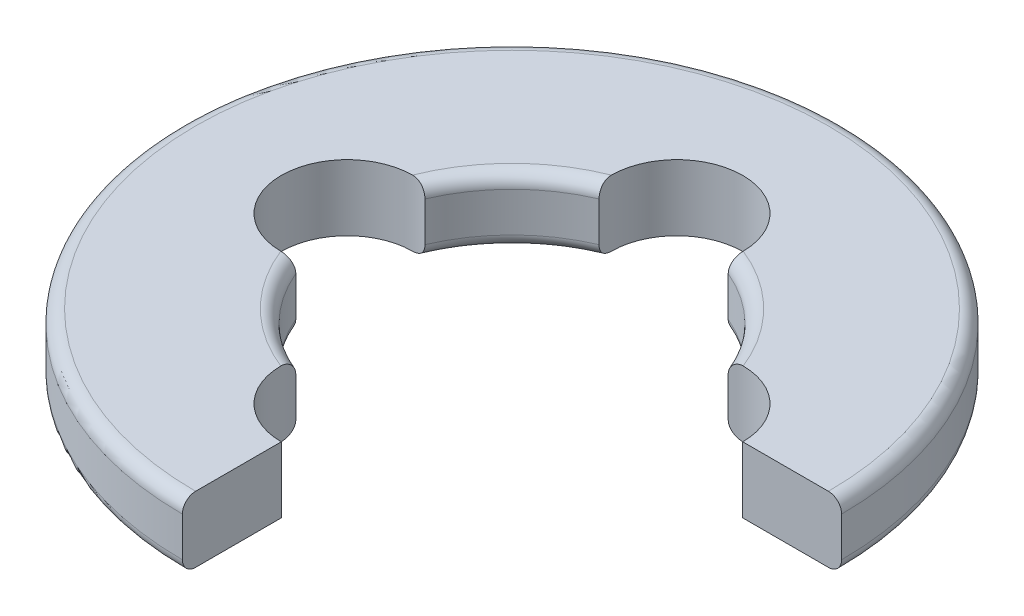
ISO-10303-21;
HEADER;
FILE_DESCRIPTION(('STEP AP214'),'2;1');
FILE_NAME('part.step','',(''),(''),'','','');
FILE_SCHEMA(('AUTOMOTIVE_DESIGN { 1 0 10303 214 1 1 1 1 }'));
ENDSEC;
DATA;
#1=APPLICATION_CONTEXT('core data for automotive mechanical design processes');
#2=APPLICATION_PROTOCOL_DEFINITION('international standard','automotive_design',2000,#1);
#3=PRODUCT_CONTEXT('',#1,'mechanical');
#4=PRODUCT('Part','Part','',(#3));
#5=PRODUCT_RELATED_PRODUCT_CATEGORY('part','',(#4));
#6=PRODUCT_DEFINITION_FORMATION('','',#4);
#7=PRODUCT_DEFINITION_CONTEXT('part definition',#1,'design');
#8=PRODUCT_DEFINITION('design','',#6,#7);
#9=PRODUCT_DEFINITION_SHAPE('','',#8);
#10=(LENGTH_UNIT() NAMED_UNIT(*) SI_UNIT(.MILLI.,.METRE.));
#11=(NAMED_UNIT(*) PLANE_ANGLE_UNIT() SI_UNIT($,.RADIAN.));
#12=(NAMED_UNIT(*) SI_UNIT($,.STERADIAN.) SOLID_ANGLE_UNIT());
#13=UNCERTAINTY_MEASURE_WITH_UNIT(LENGTH_MEASURE(1.E-05),#10,'distance_accuracy_value','');
#14=(GEOMETRIC_REPRESENTATION_CONTEXT(3) GLOBAL_UNCERTAINTY_ASSIGNED_CONTEXT((#13)) GLOBAL_UNIT_ASSIGNED_CONTEXT((#10,
#11,#12)) REPRESENTATION_CONTEXT('',''));
#15=CARTESIAN_POINT('',(0.,0.,0.));
#16=DIRECTION('',(0.,0.,1.));
#17=DIRECTION('',(1.,0.,0.));
#18=AXIS2_PLACEMENT_3D('',#15,#16,#17);
#19=CARTESIAN_POINT('',(1.25,-0.25,0.));
#20=DIRECTION('',(0.,1.,0.));
#21=DIRECTION('',(0.,0.,1.));
#22=AXIS2_PLACEMENT_3D('',#19,#20,#21);
#23=CYLINDRICAL_SURFACE('',#22,0.5);
#24=DIRECTION('',(0.,1.,0.));
#25=VECTOR('',#24,1.);
#26=CARTESIAN_POINT('',(1.15,-0.25,-0.489897948556636));
#27=LINE('',#26,#25);
#28=CARTESIAN_POINT('',(1.15,-0.15,-0.489897948556636));
#29=VERTEX_POINT('',#28);
#30=CARTESIAN_POINT('',(1.15,0.15,-0.489897948556636));
#31=VERTEX_POINT('',#30);
#32=EDGE_CURVE('E203',#29,#31,#27,.T.);
#33=ORIENTED_EDGE('',*,*,#32,.F.);
#34=CARTESIAN_POINT('',(1.15,-0.15,-0.489897948556636));
#35=CARTESIAN_POINT('',(1.14999576897907,-0.15551881935343,-0.489894425959057));
#36=CARTESIAN_POINT('',(1.15045655526133,-0.161036133887587,-0.489991099147229));
#37=CARTESIAN_POINT('',(1.15227706137353,-0.17190905517075,-0.490358824419199));
#38=CARTESIAN_POINT('',(1.15363589421882,-0.177264816031266,-0.490629704434909));
#39=CARTESIAN_POINT('',(1.15722234196748,-0.187669852679797,-0.491320087042052));
#40=CARTESIAN_POINT('',(1.1594503626547,-0.192718984042355,-0.491739659042546));
#41=CARTESIAN_POINT('',(1.16471383868249,-0.202365620348351,-0.492679851419551));
#42=CARTESIAN_POINT('',(1.16774917887255,-0.20696318957155,-0.493200457382413));
#43=CARTESIAN_POINT('',(1.17455162207763,-0.215592255809707,-0.494286738701992));
#44=CARTESIAN_POINT('',(1.17832045114831,-0.219622378174961,-0.494852518473124));
#45=CARTESIAN_POINT('',(1.18647690479225,-0.22700028803333,-0.49596544918812));
#46=CARTESIAN_POINT('',(1.19086453073348,-0.230348074017962,-0.496512600090798));
#47=CARTESIAN_POINT('',(1.20020089224568,-0.23633108066362,-0.497536323081564));
#48=CARTESIAN_POINT('',(1.20515698884395,-0.238954988780669,-0.498011727197181));
#49=CARTESIAN_POINT('',(1.2154361148767,-0.243379715196276,-0.498830559680716));
#50=CARTESIAN_POINT('',(1.2207593095127,-0.245180160101293,-0.499173928166801));
#51=CARTESIAN_POINT('',(1.23073078392134,-0.247715126148441,-0.499649181994129));
#52=CARTESIAN_POINT('',(1.23534645680418,-0.248576087354324,-0.49980652642366));
#53=CARTESIAN_POINT('',(1.24464204756362,-0.249718525583404,-0.499993222845184));
#54=CARTESIAN_POINT('',(1.24932181126577,-0.25000120817979,-0.500022841258731));
#55=CARTESIAN_POINT('',(1.25399999999998,-0.250000000000035,-0.499983999744171));
#56=B_SPLINE_CURVE_WITH_KNOTS('',3,(#34,#35,#36,#37,#38,#39,#40,#41,#42,#43,#44,#45,#46,#47,#48,
#49,#50,#51,#52,#53,#54,#55),.UNSPECIFIED.,.F.,.F.,(4,2,2,2,2,2,2,2,2,2,4),(0.,
0.0165342347343365,0.0330521632551211,0.0495778124836152,0.0661011058700446,0.0826637627840548,
0.0992264563137262,0.116034956665209,0.132851071173765,0.146907455494912,0.160934505614396),.UNSPECIFIED.);
#57=CARTESIAN_POINT('',(1.254,-0.25,-0.499983999743992));
#58=VERTEX_POINT('',#57);
#59=EDGE_CURVE('E241',#29,#58,#56,.T.);
#60=ORIENTED_EDGE('',*,*,#59,.T.);
#61=CARTESIAN_POINT('',(1.25,-0.25,0.));
#62=DIRECTION('',(0.,-1.,0.));
#63=DIRECTION('',(0.,0.,1.));
#64=AXIS2_PLACEMENT_3D('',#61,#62,#63);
#65=CIRCLE('',#64,0.5);
#66=CARTESIAN_POINT('',(1.75,-0.25,0.));
#67=VERTEX_POINT('',#66);
#68=EDGE_CURVE('E171',#58,#67,#65,.T.);
#69=ORIENTED_EDGE('',*,*,#68,.T.);
#70=DIRECTION('',(0.,1.,0.));
#71=VECTOR('',#70,1.);
#72=CARTESIAN_POINT('',(1.75,-0.25,0.));
#73=LINE('',#72,#71);
#74=CARTESIAN_POINT('',(1.75,0.25,0.));
#75=VERTEX_POINT('',#74);
#76=EDGE_CURVE('E168',#67,#75,#73,.T.);
#77=ORIENTED_EDGE('',*,*,#76,.T.);
#78=CARTESIAN_POINT('',(1.25,0.25,0.));
#79=DIRECTION('',(0.,-1.,0.));
#80=DIRECTION('',(0.,0.,1.));
#81=AXIS2_PLACEMENT_3D('',#78,#79,#80);
#82=CIRCLE('',#81,0.5);
#83=CARTESIAN_POINT('',(1.254,0.25,-0.499983999743992));
#84=VERTEX_POINT('',#83);
#85=EDGE_CURVE('E159',#84,#75,#82,.T.);
#86=ORIENTED_EDGE('',*,*,#85,.F.);
#87=CARTESIAN_POINT('',(1.254,0.25,-0.499983999743992));
#88=CARTESIAN_POINT('',(1.24794769225276,0.250004785420598,-0.500036701797534));
#89=CARTESIAN_POINT('',(1.24188903364562,0.249529113002512,-0.499971109932091));
#90=CARTESIAN_POINT('',(1.22992333953535,0.24760820830629,-0.499631538165489));
#91=CARTESIAN_POINT('',(1.2240165875268,0.246161282998267,-0.499357194268556));
#92=CARTESIAN_POINT('',(1.21252805738515,0.242284654136419,-0.498627484732648));
#93=CARTESIAN_POINT('',(1.20694706754847,0.239852671222459,-0.498171699291882));
#94=CARTESIAN_POINT('',(1.19631695690679,0.23404830197179,-0.497138378797292));
#95=CARTESIAN_POINT('',(1.1912671937093,0.230677069868737,-0.496560993387644));
#96=CARTESIAN_POINT('',(1.18209778323316,0.223263307591472,-0.495388408697326));
#97=CARTESIAN_POINT('',(1.17794468225218,0.219261771113748,-0.494795469026729));
#98=CARTESIAN_POINT('',(1.17039961900067,0.210589057525886,-0.493637912168166));
#99=CARTESIAN_POINT('',(1.16700786313583,0.205917699383825,-0.493073302692838));
#100=CARTESIAN_POINT('',(1.16119324408436,0.196215095030297,-0.492058743444695));
#101=CARTESIAN_POINT('',(1.15874122109269,0.191201612325174,-0.491605533648358));
#102=CARTESIAN_POINT('',(1.1547149371965,0.180825849937954,-0.490841103882542));
#103=CARTESIAN_POINT('',(1.1531399359082,0.175463868743124,-0.490529764186457));
#104=CARTESIAN_POINT('',(1.1513504989604,0.166717733894567,-0.490172144930821));
#105=CARTESIAN_POINT('',(1.15084419019297,0.163392715383594,-0.490069712458084));
#106=CARTESIAN_POINT('',(1.1501691098783,0.156712299505654,-0.489932478375031));
#107=CARTESIAN_POINT('',(1.14999982852834,0.153356955745674,-0.489897574620025));
#108=CARTESIAN_POINT('',(1.15000000000581,0.149999999998651,-0.489897948560545));
#109=B_SPLINE_CURVE_WITH_KNOTS('',3,(#87,#88,#89,#90,#91,#92,#93,#94,#95,#96,#97,#98,#99,#100,
#101,#102,#103,#104,#105,#106,#107,#108),.UNSPECIFIED.,.F.,.F.,(4,2,2,2,2,2,2,2,2,2,4),(0.,
0.0181459839615168,0.0363236813412451,0.0545436832541165,0.0727413928116605,0.0900473099103623,
0.107357913106134,0.124076709573132,0.140781370511469,0.150859882683232,0.160923138029622),.UNSPECIFIED.);
#110=EDGE_CURVE('E233',#84,#31,#109,.T.);
#111=ORIENTED_EDGE('',*,*,#110,.T.);
#112=EDGE_LOOP('',(#33,#60,#69,#77,#86,#111));
#113=FACE_BOUND('',#112,.T.);
#114=ADVANCED_FACE('F32',(#113),#23,.F.);
#115=CARTESIAN_POINT('',(0.,-0.25,0.));
#116=DIRECTION('',(0.,1.,0.));
#117=DIRECTION('',(0.,0.,1.));
#118=AXIS2_PLACEMENT_3D('',#115,#116,#117);
#119=CYLINDRICAL_SURFACE('',#118,1.25);
#120=DIRECTION('',(0.,1.,0.));
#121=VECTOR('',#120,1.);
#122=CARTESIAN_POINT('',(0.489897948556636,-0.25,-1.15));
#123=LINE('',#122,#121);
#124=CARTESIAN_POINT('',(0.489897948556636,-0.15,-1.15));
#125=VERTEX_POINT('',#124);
#126=CARTESIAN_POINT('',(0.489897948556636,0.15,-1.15));
#127=VERTEX_POINT('',#126);
#128=EDGE_CURVE('E207',#125,#127,#123,.T.);
#129=ORIENTED_EDGE('',*,*,#128,.F.);
#130=CARTESIAN_POINT('',(0.,-0.15,0.));
#131=DIRECTION('',(0.,1.,0.));
#132=DIRECTION('',(0.,0.,1.));
#133=AXIS2_PLACEMENT_3D('',#130,#131,#132);
#134=CIRCLE('',#133,1.25);
#135=EDGE_CURVE('E230',#125,#29,#134,.F.);
#136=ORIENTED_EDGE('',*,*,#135,.T.);
#137=ORIENTED_EDGE('',*,*,#32,.T.);
#138=CARTESIAN_POINT('',(0.,0.15,0.));
#139=DIRECTION('',(0.,1.,0.));
#140=DIRECTION('',(0.,0.,1.));
#141=AXIS2_PLACEMENT_3D('',#138,#139,#140);
#142=CIRCLE('',#141,1.25);
#143=EDGE_CURVE('E206',#31,#127,#142,.T.);
#144=ORIENTED_EDGE('',*,*,#143,.T.);
#145=EDGE_LOOP('',(#129,#136,#137,#144));
#146=FACE_BOUND('',#145,.T.);
#147=ADVANCED_FACE('F289',(#146),#119,.F.);
#148=CARTESIAN_POINT('',(0.,-0.25,-1.25));
#149=DIRECTION('',(0.,1.,0.));
#150=DIRECTION('',(0.,0.,1.));
#151=AXIS2_PLACEMENT_3D('',#148,#149,#150);
#152=CYLINDRICAL_SURFACE('',#151,0.5);
#153=CARTESIAN_POINT('',(0.,-0.25,-1.25));
#154=DIRECTION('',(0.,-1.,0.));
#155=DIRECTION('',(0.,0.,1.));
#156=AXIS2_PLACEMENT_3D('',#153,#154,#155);
#157=CIRCLE('',#156,0.5);
#158=CARTESIAN_POINT('',(-0.499983999743996,-0.25,-1.254));
#159=VERTEX_POINT('',#158);
#160=CARTESIAN_POINT('',(0.499983999743987,-0.25,-1.254));
#161=VERTEX_POINT('',#160);
#162=EDGE_CURVE('E175',#159,#161,#157,.T.);
#163=ORIENTED_EDGE('',*,*,#162,.T.);
#164=CARTESIAN_POINT('',(0.499983999743988,-0.25,-1.254));
#165=CARTESIAN_POINT('',(0.50003670179753,-0.250004785420598,-1.24794769225276));
#166=CARTESIAN_POINT('',(0.499971109932086,-0.249529113002512,-1.24188903364562));
#167=CARTESIAN_POINT('',(0.499631538165484,-0.24760820830629,-1.22992333953535));
#168=CARTESIAN_POINT('',(0.499357194268552,-0.246161282998267,-1.2240165875268));
#169=CARTESIAN_POINT('',(0.498627484732644,-0.242284654136419,-1.21252805738515));
#170=CARTESIAN_POINT('',(0.498171699291877,-0.239852671222459,-1.20694706754847));
#171=CARTESIAN_POINT('',(0.497138378797288,-0.23404830197179,-1.19631695690679));
#172=CARTESIAN_POINT('',(0.49656099338764,-0.230677069868737,-1.1912671937093));
#173=CARTESIAN_POINT('',(0.495388408697321,-0.223263307591472,-1.18209778323316));
#174=CARTESIAN_POINT('',(0.494795469026725,-0.219261771113748,-1.17794468225218));
#175=CARTESIAN_POINT('',(0.493637912168162,-0.210589057525886,-1.17039961900067));
#176=CARTESIAN_POINT('',(0.493073302692834,-0.205917699383825,-1.16700786313583));
#177=CARTESIAN_POINT('',(0.492058743444691,-0.196215095030297,-1.16119324408437));
#178=CARTESIAN_POINT('',(0.491605533648353,-0.191201612325174,-1.15874122109269));
#179=CARTESIAN_POINT('',(0.490841103882538,-0.180825849937954,-1.1547149371965));
#180=CARTESIAN_POINT('',(0.490529764186453,-0.175463868743124,-1.1531399359082));
#181=CARTESIAN_POINT('',(0.490172144930817,-0.166717733894567,-1.15135049896041));
#182=CARTESIAN_POINT('',(0.49006971245808,-0.163392715383594,-1.15084419019297));
#183=CARTESIAN_POINT('',(0.489932478375027,-0.156712299505654,-1.1501691098783));
#184=CARTESIAN_POINT('',(0.489897574620021,-0.153356955745674,-1.14999982852835));
#185=CARTESIAN_POINT('',(0.489897948560541,-0.149999999998651,-1.15000000000581));
#186=B_SPLINE_CURVE_WITH_KNOTS('',3,(#164,#165,#166,#167,#168,#169,#170,#171,#172,#173,#174,
#175,#176,#177,#178,#179,#180,#181,#182,#183,#184,#185),.UNSPECIFIED.,.F.,.F.,(4,2,2,2,2,2,2,2,
2,2,4),(0.,0.0181459839615168,0.0363236813412451,0.0545436832541165,0.0727413928116605,
0.0900473099103623,0.107357913106134,0.124076709573132,0.140781370511469,0.150859882683232,
0.160923138029623),.UNSPECIFIED.);
#187=EDGE_CURVE('E296',#161,#125,#186,.T.);
#188=ORIENTED_EDGE('',*,*,#187,.T.);
#189=ORIENTED_EDGE('',*,*,#128,.T.);
#190=CARTESIAN_POINT('',(0.489897948556636,0.15,-1.15));
#191=CARTESIAN_POINT('',(0.489894425959054,0.15551881935343,-1.14999576897908));
#192=CARTESIAN_POINT('',(0.489991099147225,0.161036133887587,-1.15045655526133));
#193=CARTESIAN_POINT('',(0.490358824419195,0.17190905517075,-1.15227706137353));
#194=CARTESIAN_POINT('',(0.490629704434905,0.177264816031267,-1.15363589421882));
#195=CARTESIAN_POINT('',(0.491320087042048,0.187669852679797,-1.15722234196749));
#196=CARTESIAN_POINT('',(0.491739659042541,0.192718984042355,-1.15945036265471));
#197=CARTESIAN_POINT('',(0.492679851419547,0.202365620348351,-1.16471383868249));
#198=CARTESIAN_POINT('',(0.493200457382409,0.20696318957155,-1.16774917887255));
#199=CARTESIAN_POINT('',(0.494286738701988,0.215592255809707,-1.17455162207763));
#200=CARTESIAN_POINT('',(0.49485251847312,0.219622378174961,-1.17832045114831));
#201=CARTESIAN_POINT('',(0.495965449188116,0.22700028803333,-1.18647690479225));
#202=CARTESIAN_POINT('',(0.496512600090794,0.230348074017962,-1.19086453073348));
#203=CARTESIAN_POINT('',(0.49753632308156,0.23633108066362,-1.20020089224568));
#204=CARTESIAN_POINT('',(0.498011727197176,0.238954988780669,-1.20515698884395));
#205=CARTESIAN_POINT('',(0.498830559680711,0.243379715196276,-1.2154361148767));
#206=CARTESIAN_POINT('',(0.499173928166796,0.245180160101293,-1.2207593095127));
#207=CARTESIAN_POINT('',(0.499649181994125,0.247715126148441,-1.23073078392134));
#208=CARTESIAN_POINT('',(0.499806526423656,0.248576087354324,-1.23534645680419));
#209=CARTESIAN_POINT('',(0.49999322284518,0.249718525583404,-1.24464204756362));
#210=CARTESIAN_POINT('',(0.500022841258727,0.25000120817979,-1.24932181126577));
#211=CARTESIAN_POINT('',(0.499983999744167,0.250000000000035,-1.25399999999998));
#212=B_SPLINE_CURVE_WITH_KNOTS('',3,(#190,#191,#192,#193,#194,#195,#196,#197,#198,#199,#200,
#201,#202,#203,#204,#205,#206,#207,#208,#209,#210,#211),.UNSPECIFIED.,.F.,.F.,(4,2,2,2,2,2,2,2,
2,2,4),(0.,0.0165342347343366,0.0330521632551212,0.0495778124836153,0.0661011058700448,
0.0826637627840553,0.0992264563137263,0.116034956665209,0.132851071173765,0.146907455494912,
0.160934505614396),.UNSPECIFIED.);
#213=CARTESIAN_POINT('',(0.499983999743987,0.25,-1.254));
#214=VERTEX_POINT('',#213);
#215=EDGE_CURVE('E262',#127,#214,#212,.T.);
#216=ORIENTED_EDGE('',*,*,#215,.T.);
#217=CARTESIAN_POINT('',(0.,0.25,-1.25));
#218=DIRECTION('',(0.,-1.,0.));
#219=DIRECTION('',(0.,0.,1.));
#220=AXIS2_PLACEMENT_3D('',#217,#218,#219);
#221=CIRCLE('',#220,0.5);
#222=CARTESIAN_POINT('',(-0.499983999743996,0.25,-1.254));
#223=VERTEX_POINT('',#222);
#224=EDGE_CURVE('E188',#223,#214,#221,.T.);
#225=ORIENTED_EDGE('',*,*,#224,.F.);
#226=CARTESIAN_POINT('',(-0.499983999743996,0.25,-1.254));
#227=CARTESIAN_POINT('',(-0.500036701797539,0.250004785420598,-1.24794769225276));
#228=CARTESIAN_POINT('',(-0.499971109932095,0.249529113002512,-1.24188903364562));
#229=CARTESIAN_POINT('',(-0.499631538165493,0.24760820830629,-1.22992333953535));
#230=CARTESIAN_POINT('',(-0.49935719426856,0.246161282998267,-1.22401658752679));
#231=CARTESIAN_POINT('',(-0.498627484732653,0.242284654136419,-1.21252805738515));
#232=CARTESIAN_POINT('',(-0.498171699291886,0.239852671222459,-1.20694706754847));
#233=CARTESIAN_POINT('',(-0.497138378797296,0.23404830197179,-1.19631695690678));
#234=CARTESIAN_POINT('',(-0.496560993387648,0.230677069868736,-1.19126719370929));
#235=CARTESIAN_POINT('',(-0.49538840869733,0.223263307591472,-1.18209778323315));
#236=CARTESIAN_POINT('',(-0.494795469026733,0.219261771113748,-1.17794468225218));
#237=CARTESIAN_POINT('',(-0.49363791216817,0.210589057525885,-1.17039961900067));
#238=CARTESIAN_POINT('',(-0.493073302692842,0.205917699383824,-1.16700786313583));
#239=CARTESIAN_POINT('',(-0.492058743444699,0.196215095030296,-1.16119324408436));
#240=CARTESIAN_POINT('',(-0.491605533648361,0.191201612325173,-1.15874122109269));
#241=CARTESIAN_POINT('',(-0.490841103882546,0.180825849937954,-1.1547149371965));
#242=CARTESIAN_POINT('',(-0.490529764186461,0.175463868743123,-1.1531399359082));
#243=CARTESIAN_POINT('',(-0.490172144930825,0.166717733894567,-1.1513504989604));
#244=CARTESIAN_POINT('',(-0.490069712458088,0.163392715383594,-1.15084419019297));
#245=CARTESIAN_POINT('',(-0.489932478375035,0.156712299505654,-1.1501691098783));
#246=CARTESIAN_POINT('',(-0.489897574620029,0.153356955745674,-1.14999982852834));
#247=CARTESIAN_POINT('',(-0.489897948560549,0.149999999998651,-1.15000000000581));
#248=B_SPLINE_CURVE_WITH_KNOTS('',3,(#226,#227,#228,#229,#230,#231,#232,#233,#234,#235,#236,
#237,#238,#239,#240,#241,#242,#243,#244,#245,#246,#247),.UNSPECIFIED.,.F.,.F.,(4,2,2,2,2,2,2,2,
2,2,4),(0.,0.0181459839615165,0.0363236813412451,0.0545436832541163,0.0727413928116606,
0.0900473099103627,0.107357913106135,0.124076709573132,0.140781370511469,0.150859882683232,
0.160923138029622),.UNSPECIFIED.);
#249=CARTESIAN_POINT('',(-0.48989794855664,0.15,-1.15));
#250=VERTEX_POINT('',#249);
#251=EDGE_CURVE('E271',#223,#250,#248,.T.);
#252=ORIENTED_EDGE('',*,*,#251,.T.);
#253=DIRECTION('',(0.,1.,0.));
#254=VECTOR('',#253,1.);
#255=CARTESIAN_POINT('',(-0.48989794855664,-0.25,-1.15));
#256=LINE('',#255,#254);
#257=CARTESIAN_POINT('',(-0.48989794855664,-0.15,-1.15));
#258=VERTEX_POINT('',#257);
#259=EDGE_CURVE('E210',#258,#250,#256,.T.);
#260=ORIENTED_EDGE('',*,*,#259,.F.);
#261=CARTESIAN_POINT('',(-0.48989794855664,-0.15,-1.15));
#262=CARTESIAN_POINT('',(-0.489894425959061,-0.15551881935343,-1.14999576897907));
#263=CARTESIAN_POINT('',(-0.489991099147233,-0.161036133887587,-1.15045655526133));
#264=CARTESIAN_POINT('',(-0.490358824419203,-0.17190905517075,-1.15227706137353));
#265=CARTESIAN_POINT('',(-0.490629704434913,-0.177264816031266,-1.15363589421882));
#266=CARTESIAN_POINT('',(-0.491320087042056,-0.187669852679796,-1.15722234196748));
#267=CARTESIAN_POINT('',(-0.491739659042549,-0.192718984042355,-1.1594503626547));
#268=CARTESIAN_POINT('',(-0.492679851419555,-0.20236562034835,-1.16471383868249));
#269=CARTESIAN_POINT('',(-0.493200457382417,-0.20696318957155,-1.16774917887255));
#270=CARTESIAN_POINT('',(-0.494286738701996,-0.215592255809707,-1.17455162207763));
#271=CARTESIAN_POINT('',(-0.494852518473128,-0.219622378174961,-1.17832045114831));
#272=CARTESIAN_POINT('',(-0.495965449188124,-0.22700028803333,-1.18647690479225));
#273=CARTESIAN_POINT('',(-0.496512600090802,-0.230348074017962,-1.19086453073347));
#274=CARTESIAN_POINT('',(-0.497536323081569,-0.23633108066362,-1.20020089224568));
#275=CARTESIAN_POINT('',(-0.498011727197185,-0.238954988780669,-1.20515698884394));
#276=CARTESIAN_POINT('',(-0.49883055968072,-0.243379715196276,-1.21543611487669));
#277=CARTESIAN_POINT('',(-0.499173928166805,-0.245180160101293,-1.2207593095127));
#278=CARTESIAN_POINT('',(-0.499649181994133,-0.247715126148441,-1.23073078392133));
#279=CARTESIAN_POINT('',(-0.499806526423664,-0.248576087354324,-1.23534645680418));
#280=CARTESIAN_POINT('',(-0.499993222845188,-0.249718525583404,-1.24464204756362));
#281=CARTESIAN_POINT('',(-0.500022841258735,-0.25000120817979,-1.24932181126576));
#282=CARTESIAN_POINT('',(-0.499983999744176,-0.250000000000035,-1.25399999999998));
#283=B_SPLINE_CURVE_WITH_KNOTS('',3,(#261,#262,#263,#264,#265,#266,#267,#268,#269,#270,#271,
#272,#273,#274,#275,#276,#277,#278,#279,#280,#281,#282),.UNSPECIFIED.,.F.,.F.,(4,2,2,2,2,2,2,2,
2,2,4),(0.,0.0165342347343365,0.033052163255121,0.049577812483615,0.0661011058700445,
0.082663762784055,0.0992264563137262,0.116034956665209,0.132851071173765,0.146907455494912,
0.160934505614395),.UNSPECIFIED.);
#284=EDGE_CURVE('E270',#258,#159,#283,.T.);
#285=ORIENTED_EDGE('',*,*,#284,.T.);
#286=EDGE_LOOP('',(#163,#188,#189,#216,#225,#252,#260,#285));
#287=FACE_BOUND('',#286,.T.);
#288=ADVANCED_FACE('F283',(#287),#152,.F.);
#289=CARTESIAN_POINT('',(0.,-0.25,0.));
#290=DIRECTION('',(0.,1.,0.));
#291=DIRECTION('',(0.,0.,1.));
#292=AXIS2_PLACEMENT_3D('',#289,#290,#291);
#293=CYLINDRICAL_SURFACE('',#292,1.25);
#294=DIRECTION('',(0.,1.,0.));
#295=VECTOR('',#294,1.);
#296=CARTESIAN_POINT('',(-1.15,-0.25,-0.489897948556636));
#297=LINE('',#296,#295);
#298=CARTESIAN_POINT('',(-1.15,-0.15,-0.489897948556636));
#299=VERTEX_POINT('',#298);
#300=CARTESIAN_POINT('',(-1.15,0.15,-0.489897948556636));
#301=VERTEX_POINT('',#300);
#302=EDGE_CURVE('E213',#299,#301,#297,.T.);
#303=ORIENTED_EDGE('',*,*,#302,.F.);
#304=CARTESIAN_POINT('',(0.,-0.15,0.));
#305=DIRECTION('',(0.,1.,0.));
#306=DIRECTION('',(0.,0.,1.));
#307=AXIS2_PLACEMENT_3D('',#304,#305,#306);
#308=CIRCLE('',#307,1.25);
#309=EDGE_CURVE('E355',#299,#258,#308,.F.);
#310=ORIENTED_EDGE('',*,*,#309,.T.);
#311=ORIENTED_EDGE('',*,*,#259,.T.);
#312=CARTESIAN_POINT('',(0.,0.15,0.));
#313=DIRECTION('',(0.,1.,0.));
#314=DIRECTION('',(0.,0.,1.));
#315=AXIS2_PLACEMENT_3D('',#312,#313,#314);
#316=CIRCLE('',#315,1.25);
#317=EDGE_CURVE('E302',#250,#301,#316,.T.);
#318=ORIENTED_EDGE('',*,*,#317,.T.);
#319=EDGE_LOOP('',(#303,#310,#311,#318));
#320=FACE_BOUND('',#319,.T.);
#321=ADVANCED_FACE('F288',(#320),#293,.F.);
#322=CARTESIAN_POINT('',(-1.25,-0.25,0.));
#323=DIRECTION('',(0.,1.,0.));
#324=DIRECTION('',(0.,0.,1.));
#325=AXIS2_PLACEMENT_3D('',#322,#323,#324);
#326=CYLINDRICAL_SURFACE('',#325,0.5);
#327=CARTESIAN_POINT('',(-1.25,-0.25,0.));
#328=DIRECTION('',(0.,-1.,0.));
#329=DIRECTION('',(0.,0.,1.));
#330=AXIS2_PLACEMENT_3D('',#327,#328,#329);
#331=CIRCLE('',#330,0.5);
#332=CARTESIAN_POINT('',(-1.254,-0.25,0.499983999744001));
#333=VERTEX_POINT('',#332);
#334=CARTESIAN_POINT('',(-1.254,-0.25,-0.499983999743983));
#335=VERTEX_POINT('',#334);
#336=EDGE_CURVE('E198',#333,#335,#331,.T.);
#337=ORIENTED_EDGE('',*,*,#336,.T.);
#338=CARTESIAN_POINT('',(-1.254,-0.25,-0.499983999743983));
#339=CARTESIAN_POINT('',(-1.24794769225277,-0.250004785420598,-0.500036701797526));
#340=CARTESIAN_POINT('',(-1.24188903364562,-0.249529113002512,-0.499971109932082));
#341=CARTESIAN_POINT('',(-1.22992333953535,-0.24760820830629,-0.49963153816548));
#342=CARTESIAN_POINT('',(-1.2240165875268,-0.246161282998267,-0.499357194268547));
#343=CARTESIAN_POINT('',(-1.21252805738516,-0.242284654136419,-0.49862748473264));
#344=CARTESIAN_POINT('',(-1.20694706754847,-0.239852671222459,-0.498171699291873));
#345=CARTESIAN_POINT('',(-1.19631695690679,-0.23404830197179,-0.497138378797284));
#346=CARTESIAN_POINT('',(-1.1912671937093,-0.230677069868737,-0.496560993387635));
#347=CARTESIAN_POINT('',(-1.18209778323316,-0.223263307591472,-0.495388408697317));
#348=CARTESIAN_POINT('',(-1.17794468225218,-0.219261771113748,-0.494795469026721));
#349=CARTESIAN_POINT('',(-1.17039961900067,-0.210589057525885,-0.493637912168158));
#350=CARTESIAN_POINT('',(-1.16700786313584,-0.205917699383825,-0.49307330269283));
#351=CARTESIAN_POINT('',(-1.16119324408437,-0.196215095030297,-0.492058743444687));
#352=CARTESIAN_POINT('',(-1.15874122109269,-0.191201612325174,-0.491605533648349));
#353=CARTESIAN_POINT('',(-1.15471493719651,-0.180825849937954,-0.490841103882534));
#354=CARTESIAN_POINT('',(-1.1531399359082,-0.175463868743124,-0.490529764186449));
#355=CARTESIAN_POINT('',(-1.15135049896041,-0.166717733894567,-0.490172144930813));
#356=CARTESIAN_POINT('',(-1.15084419019297,-0.163392715383594,-0.490069712458076));
#357=CARTESIAN_POINT('',(-1.1501691098783,-0.156712299505654,-0.489932478375023));
#358=CARTESIAN_POINT('',(-1.14999982852835,-0.153356955745674,-0.489897574620017));
#359=CARTESIAN_POINT('',(-1.15000000000582,-0.149999999998651,-0.489897948560537));
#360=B_SPLINE_CURVE_WITH_KNOTS('',3,(#338,#339,#340,#341,#342,#343,#344,#345,#346,#347,#348,
#349,#350,#351,#352,#353,#354,#355,#356,#357,#358,#359),.UNSPECIFIED.,.F.,.F.,(4,2,2,2,2,2,2,2,
2,2,4),(0.,0.0181459839615167,0.0363236813412451,0.0545436832541165,0.0727413928116605,
0.0900473099103623,0.107357913106134,0.124076709573132,0.140781370511469,0.150859882683232,
0.160923138029623),.UNSPECIFIED.);
#361=EDGE_CURVE('E317',#335,#299,#360,.T.);
#362=ORIENTED_EDGE('',*,*,#361,.T.);
#363=ORIENTED_EDGE('',*,*,#302,.T.);
#364=CARTESIAN_POINT('',(-1.15,0.15,-0.489897948556636));
#365=CARTESIAN_POINT('',(-1.14999576897908,0.15551881935343,-0.489894425959052));
#366=CARTESIAN_POINT('',(-1.15045655526133,0.161036133887587,-0.489991099147222));
#367=CARTESIAN_POINT('',(-1.15227706137353,0.17190905517075,-0.49035882441919));
#368=CARTESIAN_POINT('',(-1.15363589421883,0.177264816031267,-0.490629704434901));
#369=CARTESIAN_POINT('',(-1.15722234196749,0.187669852679797,-0.491320087042044));
#370=CARTESIAN_POINT('',(-1.15945036265471,0.192718984042355,-0.491739659042537));
#371=CARTESIAN_POINT('',(-1.16471383868249,0.202365620348351,-0.492679851419543));
#372=CARTESIAN_POINT('',(-1.16774917887255,0.206963189571551,-0.493200457382405));
#373=CARTESIAN_POINT('',(-1.17455162207763,0.215592255809707,-0.494286738701984));
#374=CARTESIAN_POINT('',(-1.17832045114832,0.219622378174962,-0.494852518473116));
#375=CARTESIAN_POINT('',(-1.18647690479225,0.22700028803333,-0.495965449188112));
#376=CARTESIAN_POINT('',(-1.19086453073348,0.230348074017962,-0.49651260009079));
#377=CARTESIAN_POINT('',(-1.20020089224568,0.236331080663621,-0.497536323081556));
#378=CARTESIAN_POINT('',(-1.20515698884395,0.238954988780669,-0.498011727197172));
#379=CARTESIAN_POINT('',(-1.2154361148767,0.243379715196276,-0.498830559680707));
#380=CARTESIAN_POINT('',(-1.2207593095127,0.245180160101293,-0.499173928166792));
#381=CARTESIAN_POINT('',(-1.23073078392134,0.247715126148441,-0.49964918199412));
#382=CARTESIAN_POINT('',(-1.23534645680419,0.248576087354324,-0.499806526423651));
#383=CARTESIAN_POINT('',(-1.24464204756362,0.249718525583404,-0.499993222845175));
#384=CARTESIAN_POINT('',(-1.24932181126577,0.25000120817979,-0.500022841258722));
#385=CARTESIAN_POINT('',(-1.25399999999999,0.250000000000035,-0.499983999744163));
#386=B_SPLINE_CURVE_WITH_KNOTS('',3,(#364,#365,#366,#367,#368,#369,#370,#371,#372,#373,#374,
#375,#376,#377,#378,#379,#380,#381,#382,#383,#384,#385),.UNSPECIFIED.,.F.,.F.,(4,2,2,2,2,2,2,2,
2,2,4),(0.,0.0165342347343365,0.0330521632551215,0.0495778124836159,0.0661011058700453,
0.0826637627840556,0.0992264563137267,0.116034956665209,0.132851071173766,0.146907455494913,
0.160934505614396),.UNSPECIFIED.);
#387=CARTESIAN_POINT('',(-1.254,0.25,-0.499983999743983));
#388=VERTEX_POINT('',#387);
#389=EDGE_CURVE('E348',#301,#388,#386,.T.);
#390=ORIENTED_EDGE('',*,*,#389,.T.);
#391=CARTESIAN_POINT('',(-1.25,0.25,0.));
#392=DIRECTION('',(0.,-1.,0.));
#393=DIRECTION('',(0.,0.,1.));
#394=AXIS2_PLACEMENT_3D('',#391,#392,#393);
#395=CIRCLE('',#394,0.5);
#396=CARTESIAN_POINT('',(-1.254,0.25,0.499983999744001));
#397=VERTEX_POINT('',#396);
#398=EDGE_CURVE('E185',#397,#388,#395,.T.);
#399=ORIENTED_EDGE('',*,*,#398,.F.);
#400=CARTESIAN_POINT('',(-1.254,0.25,0.499983999744001));
#401=CARTESIAN_POINT('',(-1.24794769225276,0.250004785420598,0.500036701797543));
#402=CARTESIAN_POINT('',(-1.24188903364561,0.249529113002512,0.499971109932099));
#403=CARTESIAN_POINT('',(-1.22992333953535,0.24760820830629,0.499631538165497));
#404=CARTESIAN_POINT('',(-1.22401658752679,0.246161282998267,0.499357194268565));
#405=CARTESIAN_POINT('',(-1.21252805738515,0.242284654136419,0.498627484732657));
#406=CARTESIAN_POINT('',(-1.20694706754847,0.239852671222459,0.49817169929189));
#407=CARTESIAN_POINT('',(-1.19631695690678,0.23404830197179,0.4971383787973));
#408=CARTESIAN_POINT('',(-1.19126719370929,0.230677069868737,0.496560993387652));
#409=CARTESIAN_POINT('',(-1.18209778323315,0.223263307591472,0.495388408697334));
#410=CARTESIAN_POINT('',(-1.17794468225218,0.219261771113748,0.494795469026737));
#411=CARTESIAN_POINT('',(-1.17039961900067,0.210589057525885,0.493637912168174));
#412=CARTESIAN_POINT('',(-1.16700786313583,0.205917699383825,0.493073302692846));
#413=CARTESIAN_POINT('',(-1.16119324408436,0.196215095030297,0.492058743444704));
#414=CARTESIAN_POINT('',(-1.15874122109268,0.191201612325174,0.491605533648366));
#415=CARTESIAN_POINT('',(-1.1547149371965,0.180825849937954,0.49084110388255));
#416=CARTESIAN_POINT('',(-1.15313993590819,0.175463868743124,0.490529764186465));
#417=CARTESIAN_POINT('',(-1.1513504989604,0.166717733894567,0.490172144930829));
#418=CARTESIAN_POINT('',(-1.15084419019297,0.163392715383594,0.490069712458092));
#419=CARTESIAN_POINT('',(-1.15016910987829,0.156712299505654,0.489932478375039));
#420=CARTESIAN_POINT('',(-1.14999982852834,0.153356955745674,0.489897574620033));
#421=CARTESIAN_POINT('',(-1.15000000000581,0.149999999998651,0.489897948560553));
#422=B_SPLINE_CURVE_WITH_KNOTS('',3,(#400,#401,#402,#403,#404,#405,#406,#407,#408,#409,#410,
#411,#412,#413,#414,#415,#416,#417,#418,#419,#420,#421),.UNSPECIFIED.,.F.,.F.,(4,2,2,2,2,2,2,2,
2,2,4),(0.,0.0181459839615168,0.0363236813412451,0.0545436832541163,0.0727413928116606,
0.0900473099103624,0.107357913106135,0.124076709573132,0.140781370511469,0.150859882683232,
0.160923138029622),.UNSPECIFIED.);
#423=CARTESIAN_POINT('',(-1.15,0.15,0.489897948556644));
#424=VERTEX_POINT('',#423);
#425=EDGE_CURVE('E342',#397,#424,#422,.T.);
#426=ORIENTED_EDGE('',*,*,#425,.T.);
#427=DIRECTION('',(0.,1.,0.));
#428=VECTOR('',#427,1.);
#429=CARTESIAN_POINT('',(-1.15,-0.25,0.489897948556644));
#430=LINE('',#429,#428);
#431=CARTESIAN_POINT('',(-1.15,-0.15,0.489897948556644));
#432=VERTEX_POINT('',#431);
#433=EDGE_CURVE('E216',#432,#424,#430,.T.);
#434=ORIENTED_EDGE('',*,*,#433,.F.);
#435=CARTESIAN_POINT('',(-1.15,-0.15,0.489897948556643));
#436=CARTESIAN_POINT('',(-1.14999576897907,-0.15551881935343,0.489894425959065));
#437=CARTESIAN_POINT('',(-1.15045655526132,-0.161036133887587,0.489991099147237));
#438=CARTESIAN_POINT('',(-1.15227706137352,-0.17190905517075,0.490358824419207));
#439=CARTESIAN_POINT('',(-1.15363589421882,-0.177264816031266,0.490629704434918));
#440=CARTESIAN_POINT('',(-1.15722234196748,-0.187669852679797,0.49132008704206));
#441=CARTESIAN_POINT('',(-1.1594503626547,-0.192718984042355,0.491739659042554));
#442=CARTESIAN_POINT('',(-1.16471383868248,-0.20236562034835,0.492679851419559));
#443=CARTESIAN_POINT('',(-1.16774917887255,-0.20696318957155,0.493200457382422));
#444=CARTESIAN_POINT('',(-1.17455162207762,-0.215592255809707,0.494286738702));
#445=CARTESIAN_POINT('',(-1.17832045114831,-0.219622378174961,0.494852518473132));
#446=CARTESIAN_POINT('',(-1.18647690479224,-0.22700028803333,0.495965449188128));
#447=CARTESIAN_POINT('',(-1.19086453073347,-0.230348074017962,0.496512600090807));
#448=CARTESIAN_POINT('',(-1.20020089224567,-0.23633108066362,0.497536323081573));
#449=CARTESIAN_POINT('',(-1.20515698884394,-0.238954988780669,0.498011727197189));
#450=CARTESIAN_POINT('',(-1.21543611487669,-0.243379715196276,0.498830559680724));
#451=CARTESIAN_POINT('',(-1.22075930951269,-0.245180160101293,0.499173928166809));
#452=CARTESIAN_POINT('',(-1.23073078392133,-0.247715126148441,0.499649181994137));
#453=CARTESIAN_POINT('',(-1.23534645680418,-0.248576087354324,0.499806526423669));
#454=CARTESIAN_POINT('',(-1.24464204756361,-0.249718525583404,0.499993222845193));
#455=CARTESIAN_POINT('',(-1.24932181126576,-0.25000120817979,0.50002284125874));
#456=CARTESIAN_POINT('',(-1.25399999999998,-0.250000000000035,0.49998399974418));
#457=B_SPLINE_CURVE_WITH_KNOTS('',3,(#435,#436,#437,#438,#439,#440,#441,#442,#443,#444,#445,
#446,#447,#448,#449,#450,#451,#452,#453,#454,#455,#456),.UNSPECIFIED.,.F.,.F.,(4,2,2,2,2,2,2,2,
2,2,4),(0.,0.0165342347343365,0.033052163255121,0.0495778124836151,0.0661011058700444,
0.0826637627840549,0.0992264563137261,0.116034956665209,0.132851071173765,0.146907455494912,
0.160934505614396),.UNSPECIFIED.);
#458=EDGE_CURVE('E325',#432,#333,#457,.T.);
#459=ORIENTED_EDGE('',*,*,#458,.T.);
#460=EDGE_LOOP('',(#337,#362,#363,#390,#399,#426,#434,#459));
#461=FACE_BOUND('',#460,.T.);
#462=ADVANCED_FACE('F332',(#461),#326,.F.);
#463=CARTESIAN_POINT('',(0.,-0.25,0.));
#464=DIRECTION('',(0.,1.,0.));
#465=DIRECTION('',(0.,0.,1.));
#466=AXIS2_PLACEMENT_3D('',#463,#464,#465);
#467=CYLINDRICAL_SURFACE('',#466,1.25);
#468=DIRECTION('',(0.,1.,0.));
#469=VECTOR('',#468,1.);
#470=CARTESIAN_POINT('',(-0.489897948556636,-0.25,1.15));
#471=LINE('',#470,#469);
#472=CARTESIAN_POINT('',(-0.489897948556636,-0.15,1.15));
#473=VERTEX_POINT('',#472);
#474=CARTESIAN_POINT('',(-0.489897948556636,0.15,1.15));
#475=VERTEX_POINT('',#474);
#476=EDGE_CURVE('E219',#473,#475,#471,.T.);
#477=ORIENTED_EDGE('',*,*,#476,.F.);
#478=CARTESIAN_POINT('',(0.,-0.15,0.));
#479=DIRECTION('',(0.,1.,0.));
#480=DIRECTION('',(0.,0.,1.));
#481=AXIS2_PLACEMENT_3D('',#478,#479,#480);
#482=CIRCLE('',#481,1.25);
#483=EDGE_CURVE('E444',#473,#432,#482,.F.);
#484=ORIENTED_EDGE('',*,*,#483,.T.);
#485=ORIENTED_EDGE('',*,*,#433,.T.);
#486=CARTESIAN_POINT('',(0.,0.15,0.));
#487=DIRECTION('',(0.,1.,0.));
#488=DIRECTION('',(0.,0.,1.));
#489=AXIS2_PLACEMENT_3D('',#486,#487,#488);
#490=CIRCLE('',#489,1.25);
#491=EDGE_CURVE('E324',#424,#475,#490,.T.);
#492=ORIENTED_EDGE('',*,*,#491,.T.);
#493=EDGE_LOOP('',(#477,#484,#485,#492));
#494=FACE_BOUND('',#493,.T.);
#495=ADVANCED_FACE('F336',(#494),#467,.F.);
#496=CARTESIAN_POINT('',(0.,-0.25,1.25));
#497=DIRECTION('',(0.,1.,0.));
#498=DIRECTION('',(0.,0.,1.));
#499=AXIS2_PLACEMENT_3D('',#496,#497,#498);
#500=CYLINDRICAL_SURFACE('',#499,0.5);
#501=CARTESIAN_POINT('',(0.,-0.25,1.25));
#502=DIRECTION('',(0.,-1.,0.));
#503=DIRECTION('',(0.,0.,1.));
#504=AXIS2_PLACEMENT_3D('',#501,#502,#503);
#505=CIRCLE('',#504,0.5);
#506=CARTESIAN_POINT('',(0.,-0.25,1.75));
#507=VERTEX_POINT('',#506);
#508=CARTESIAN_POINT('',(-0.499983999743992,-0.25,1.254));
#509=VERTEX_POINT('',#508);
#510=EDGE_CURVE('E195',#507,#509,#505,.T.);
#511=ORIENTED_EDGE('',*,*,#510,.T.);
#512=CARTESIAN_POINT('',(-0.499983999743992,-0.25,1.254));
#513=CARTESIAN_POINT('',(-0.500036701797534,-0.250004785420598,1.24794769225276));
#514=CARTESIAN_POINT('',(-0.49997110993209,-0.249529113002512,1.24188903364562));
#515=CARTESIAN_POINT('',(-0.499631538165489,-0.24760820830629,1.22992333953535));
#516=CARTESIAN_POINT('',(-0.499357194268556,-0.246161282998267,1.2240165875268));
#517=CARTESIAN_POINT('',(-0.498627484732648,-0.242284654136419,1.21252805738515));
#518=CARTESIAN_POINT('',(-0.498171699291882,-0.239852671222459,1.20694706754847));
#519=CARTESIAN_POINT('',(-0.497138378797292,-0.23404830197179,1.19631695690679));
#520=CARTESIAN_POINT('',(-0.496560993387644,-0.230677069868737,1.1912671937093));
#521=CARTESIAN_POINT('',(-0.495388408697325,-0.223263307591472,1.18209778323316));
#522=CARTESIAN_POINT('',(-0.494795469026729,-0.219261771113748,1.17794468225218));
#523=CARTESIAN_POINT('',(-0.493637912168166,-0.210589057525886,1.17039961900067));
#524=CARTESIAN_POINT('',(-0.493073302692838,-0.205917699383825,1.16700786313583));
#525=CARTESIAN_POINT('',(-0.492058743444695,-0.196215095030297,1.16119324408436));
#526=CARTESIAN_POINT('',(-0.491605533648357,-0.191201612325174,1.15874122109269));
#527=CARTESIAN_POINT('',(-0.490841103882542,-0.180825849937954,1.1547149371965));
#528=CARTESIAN_POINT('',(-0.490529764186457,-0.175463868743124,1.1531399359082));
#529=CARTESIAN_POINT('',(-0.490172144930821,-0.166717733894567,1.1513504989604));
#530=CARTESIAN_POINT('',(-0.490069712458084,-0.163392715383594,1.15084419019297));
#531=CARTESIAN_POINT('',(-0.489932478375031,-0.156712299505654,1.1501691098783));
#532=CARTESIAN_POINT('',(-0.489897574620025,-0.153356955745674,1.14999982852834));
#533=CARTESIAN_POINT('',(-0.489897948560545,-0.149999999998651,1.15000000000581));
#534=B_SPLINE_CURVE_WITH_KNOTS('',3,(#512,#513,#514,#515,#516,#517,#518,#519,#520,#521,#522,
#523,#524,#525,#526,#527,#528,#529,#530,#531,#532,#533),.UNSPECIFIED.,.F.,.F.,(4,2,2,2,2,2,2,2,
2,2,4),(0.,0.0181459839615168,0.0363236813412451,0.0545436832541163,0.0727413928116605,
0.0900473099103623,0.107357913106134,0.124076709573132,0.140781370511468,0.150859882683232,
0.160923138029622),.UNSPECIFIED.);
#535=EDGE_CURVE('E385',#509,#473,#534,.T.);
#536=ORIENTED_EDGE('',*,*,#535,.T.);
#537=ORIENTED_EDGE('',*,*,#476,.T.);
#538=CARTESIAN_POINT('',(-0.489897948556636,0.15,1.15));
#539=CARTESIAN_POINT('',(-0.489894425959057,0.15551881935343,1.14999576897907));
#540=CARTESIAN_POINT('',(-0.489991099147229,0.161036133887587,1.15045655526133));
#541=CARTESIAN_POINT('',(-0.490358824419199,0.17190905517075,1.15227706137353));
#542=CARTESIAN_POINT('',(-0.490629704434909,0.177264816031266,1.15363589421882));
#543=CARTESIAN_POINT('',(-0.491320087042052,0.187669852679797,1.15722234196748));
#544=CARTESIAN_POINT('',(-0.491739659042545,0.192718984042355,1.1594503626547));
#545=CARTESIAN_POINT('',(-0.492679851419551,0.202365620348351,1.16471383868249));
#546=CARTESIAN_POINT('',(-0.493200457382413,0.20696318957155,1.16774917887255));
#547=CARTESIAN_POINT('',(-0.494286738701992,0.215592255809707,1.17455162207763));
#548=CARTESIAN_POINT('',(-0.494852518473124,0.219622378174961,1.17832045114831));
#549=CARTESIAN_POINT('',(-0.49596544918812,0.22700028803333,1.18647690479225));
#550=CARTESIAN_POINT('',(-0.496512600090798,0.230348074017962,1.19086453073348));
#551=CARTESIAN_POINT('',(-0.497536323081564,0.23633108066362,1.20020089224568));
#552=CARTESIAN_POINT('',(-0.498011727197181,0.238954988780669,1.20515698884395));
#553=CARTESIAN_POINT('',(-0.498830559680716,0.243379715196276,1.2154361148767));
#554=CARTESIAN_POINT('',(-0.499173928166801,0.245180160101293,1.2207593095127));
#555=CARTESIAN_POINT('',(-0.499649181994129,0.247715126148441,1.23073078392134));
#556=CARTESIAN_POINT('',(-0.49980652642366,0.248576087354324,1.23534645680418));
#557=CARTESIAN_POINT('',(-0.499993222845184,0.249718525583404,1.24464204756362));
#558=CARTESIAN_POINT('',(-0.500022841258731,0.25000120817979,1.24932181126577));
#559=CARTESIAN_POINT('',(-0.499983999744171,0.250000000000035,1.25399999999998));
#560=B_SPLINE_CURVE_WITH_KNOTS('',3,(#538,#539,#540,#541,#542,#543,#544,#545,#546,#547,#548,
#549,#550,#551,#552,#553,#554,#555,#556,#557,#558,#559),.UNSPECIFIED.,.F.,.F.,(4,2,2,2,2,2,2,2,
2,2,4),(0.,0.0165342347343364,0.0330521632551211,0.0495778124836151,0.0661011058700445,
0.0826637627840549,0.0992264563137261,0.116034956665209,0.132851071173765,0.146907455494912,
0.160934505614396),.UNSPECIFIED.);
#561=CARTESIAN_POINT('',(-0.499983999743992,0.25,1.254));
#562=VERTEX_POINT('',#561);
#563=EDGE_CURVE('E391',#475,#562,#560,.T.);
#564=ORIENTED_EDGE('',*,*,#563,.T.);
#565=CARTESIAN_POINT('',(0.,0.25,1.25));
#566=DIRECTION('',(0.,-1.,0.));
#567=DIRECTION('',(0.,0.,1.));
#568=AXIS2_PLACEMENT_3D('',#565,#566,#567);
#569=CIRCLE('',#568,0.5);
#570=CARTESIAN_POINT('',(0.,0.25,1.75));
#571=VERTEX_POINT('',#570);
#572=EDGE_CURVE('E180',#571,#562,#569,.T.);
#573=ORIENTED_EDGE('',*,*,#572,.F.);
#574=DIRECTION('',(0.,1.,0.));
#575=VECTOR('',#574,1.);
#576=CARTESIAN_POINT('',(0.,-0.25,1.75));
#577=LINE('',#576,#575);
#578=EDGE_CURVE('E222',#507,#571,#577,.T.);
#579=ORIENTED_EDGE('',*,*,#578,.F.);
#580=EDGE_LOOP('',(#511,#536,#537,#564,#573,#579));
#581=FACE_BOUND('',#580,.T.);
#582=ADVANCED_FACE('F396',(#581),#500,.F.);
#583=CARTESIAN_POINT('',(0.,-0.25,1.75));
#584=DIRECTION('',(1.,0.,0.));
#585=DIRECTION('',(0.,0.,-1.));
#586=AXIS2_PLACEMENT_3D('',#583,#584,#585);
#587=PLANE('',#586);
#588=DIRECTION('',(0.,1.,0.));
#589=VECTOR('',#588,1.);
#590=CARTESIAN_POINT('',(0.,-0.25,2.5));
#591=LINE('',#590,#589);
#592=CARTESIAN_POINT('',(0.,-0.15,2.5));
#593=VERTEX_POINT('',#592);
#594=CARTESIAN_POINT('',(0.,0.15,2.5));
#595=VERTEX_POINT('',#594);
#596=EDGE_CURVE('E225',#593,#595,#591,.T.);
#597=ORIENTED_EDGE('',*,*,#596,.F.);
#598=CARTESIAN_POINT('',(0.,-0.15,2.4));
#599=DIRECTION('',(1.,0.,0.));
#600=DIRECTION('',(0.,0.,-1.));
#601=AXIS2_PLACEMENT_3D('',#598,#599,#600);
#602=CIRCLE('',#601,0.1);
#603=CARTESIAN_POINT('',(0.,-0.25,2.4));
#604=VERTEX_POINT('',#603);
#605=EDGE_CURVE('E377',#593,#604,#602,.T.);
#606=ORIENTED_EDGE('',*,*,#605,.T.);
#607=DIRECTION('',(0.,0.,-1.));
#608=VECTOR('',#607,1.);
#609=CARTESIAN_POINT('',(0.,-0.25,1.75));
#610=LINE('',#609,#608);
#611=EDGE_CURVE('E193',#604,#507,#610,.T.);
#612=ORIENTED_EDGE('',*,*,#611,.T.);
#613=ORIENTED_EDGE('',*,*,#578,.T.);
#614=DIRECTION('',(0.,0.,-1.));
#615=VECTOR('',#614,1.);
#616=CARTESIAN_POINT('',(0.,0.25,1.75));
#617=LINE('',#616,#615);
#618=CARTESIAN_POINT('',(0.,0.25,2.4));
#619=VERTEX_POINT('',#618);
#620=EDGE_CURVE('E178',#619,#571,#617,.T.);
#621=ORIENTED_EDGE('',*,*,#620,.F.);
#622=CARTESIAN_POINT('',(0.,0.15,2.4));
#623=DIRECTION('',(1.,0.,0.));
#624=DIRECTION('',(0.,0.,-1.));
#625=AXIS2_PLACEMENT_3D('',#622,#623,#624);
#626=CIRCLE('',#625,0.1);
#627=EDGE_CURVE('E55',#619,#595,#626,.T.);
#628=ORIENTED_EDGE('',*,*,#627,.T.);
#629=EDGE_LOOP('',(#597,#606,#612,#613,#621,#628));
#630=FACE_BOUND('',#629,.T.);
#631=ADVANCED_FACE('F400',(#630),#587,.T.);
#632=CARTESIAN_POINT('',(0.,-0.25,0.));
#633=DIRECTION('',(0.,1.,0.));
#634=DIRECTION('',(0.,0.,1.));
#635=AXIS2_PLACEMENT_3D('',#632,#633,#634);
#636=CYLINDRICAL_SURFACE('',#635,2.5);
#637=DIRECTION('',(0.,1.,0.));
#638=VECTOR('',#637,1.);
#639=CARTESIAN_POINT('',(2.5,-0.25,0.));
#640=LINE('',#639,#638);
#641=CARTESIAN_POINT('',(2.5,-0.15,0.));
#642=VERTEX_POINT('',#641);
#643=CARTESIAN_POINT('',(2.5,0.15,0.));
#644=VERTEX_POINT('',#643);
#645=EDGE_CURVE('E174',#642,#644,#640,.T.);
#646=ORIENTED_EDGE('',*,*,#645,.F.);
#647=CARTESIAN_POINT('',(0.,-0.15,0.));
#648=DIRECTION('',(0.,1.,0.));
#649=DIRECTION('',(0.,0.,1.));
#650=AXIS2_PLACEMENT_3D('',#647,#648,#649);
#651=CIRCLE('',#650,2.5);
#652=EDGE_CURVE('E380',#642,#593,#651,.T.);
#653=ORIENTED_EDGE('',*,*,#652,.T.);
#654=ORIENTED_EDGE('',*,*,#596,.T.);
#655=CARTESIAN_POINT('',(0.,0.15,0.));
#656=DIRECTION('',(0.,1.,0.));
#657=DIRECTION('',(0.,0.,1.));
#658=AXIS2_PLACEMENT_3D('',#655,#656,#657);
#659=CIRCLE('',#658,2.5);
#660=EDGE_CURVE('E383',#595,#644,#659,.F.);
#661=ORIENTED_EDGE('',*,*,#660,.T.);
#662=EDGE_LOOP('',(#646,#653,#654,#661));
#663=FACE_BOUND('',#662,.T.);
#664=ADVANCED_FACE('F405',(#663),#636,.T.);
#665=CARTESIAN_POINT('',(1.75,-0.25,0.));
#666=DIRECTION('',(0.,0.,1.));
#667=DIRECTION('',(1.,0.,0.));
#668=AXIS2_PLACEMENT_3D('',#665,#666,#667);
#669=PLANE('',#668);
#670=DIRECTION('',(1.,0.,0.));
#671=VECTOR('',#670,1.);
#672=CARTESIAN_POINT('',(1.75,-0.25,0.));
#673=LINE('',#672,#671);
#674=CARTESIAN_POINT('',(2.4,-0.25,0.));
#675=VERTEX_POINT('',#674);
#676=EDGE_CURVE('E191',#67,#675,#673,.T.);
#677=ORIENTED_EDGE('',*,*,#676,.T.);
#678=CARTESIAN_POINT('',(2.4,-0.15,0.));
#679=DIRECTION('',(0.,0.,1.));
#680=DIRECTION('',(1.,0.,0.));
#681=AXIS2_PLACEMENT_3D('',#678,#679,#680);
#682=CIRCLE('',#681,0.1);
#683=EDGE_CURVE('E374',#675,#642,#682,.T.);
#684=ORIENTED_EDGE('',*,*,#683,.T.);
#685=ORIENTED_EDGE('',*,*,#645,.T.);
#686=CARTESIAN_POINT('',(2.4,0.15,0.));
#687=DIRECTION('',(0.,0.,1.));
#688=DIRECTION('',(1.,0.,0.));
#689=AXIS2_PLACEMENT_3D('',#686,#687,#688);
#690=CIRCLE('',#689,0.1);
#691=CARTESIAN_POINT('',(2.4,0.25,0.));
#692=VERTEX_POINT('',#691);
#693=EDGE_CURVE('E47',#644,#692,#690,.T.);
#694=ORIENTED_EDGE('',*,*,#693,.T.);
#695=DIRECTION('',(1.,0.,0.));
#696=VECTOR('',#695,1.);
#697=CARTESIAN_POINT('',(1.75,0.25,0.));
#698=LINE('',#697,#696);
#699=EDGE_CURVE('E163',#75,#692,#698,.T.);
#700=ORIENTED_EDGE('',*,*,#699,.F.);
#701=ORIENTED_EDGE('',*,*,#76,.F.);
#702=EDGE_LOOP('',(#677,#684,#685,#694,#700,#701));
#703=FACE_BOUND('',#702,.T.);
#704=ADVANCED_FACE('F177',(#703),#669,.T.);
#705=CARTESIAN_POINT('',(1.25,-0.25,0.));
#706=DIRECTION('',(0.,1.,0.));
#707=DIRECTION('',(0.,0.,1.));
#708=AXIS2_PLACEMENT_3D('',#705,#706,#707);
#709=PLANE('',#708);
#710=ORIENTED_EDGE('',*,*,#68,.F.);
#711=CARTESIAN_POINT('',(0.,-0.25,0.));
#712=DIRECTION('',(0.,1.,0.));
#713=DIRECTION('',(0.,0.,1.));
#714=AXIS2_PLACEMENT_3D('',#711,#712,#713);
#715=CIRCLE('',#714,1.35);
#716=EDGE_CURVE('E428',#58,#161,#715,.T.);
#717=ORIENTED_EDGE('',*,*,#716,.T.);
#718=ORIENTED_EDGE('',*,*,#162,.F.);
#719=CARTESIAN_POINT('',(0.,-0.25,0.));
#720=DIRECTION('',(0.,1.,0.));
#721=DIRECTION('',(0.,0.,1.));
#722=AXIS2_PLACEMENT_3D('',#719,#720,#721);
#723=CIRCLE('',#722,1.35);
#724=EDGE_CURVE('E433',#159,#335,#723,.T.);
#725=ORIENTED_EDGE('',*,*,#724,.T.);
#726=ORIENTED_EDGE('',*,*,#336,.F.);
#727=CARTESIAN_POINT('',(0.,-0.25,0.));
#728=DIRECTION('',(0.,1.,0.));
#729=DIRECTION('',(0.,0.,1.));
#730=AXIS2_PLACEMENT_3D('',#727,#728,#729);
#731=CIRCLE('',#730,1.35);
#732=EDGE_CURVE('E430',#333,#509,#731,.T.);
#733=ORIENTED_EDGE('',*,*,#732,.T.);
#734=ORIENTED_EDGE('',*,*,#510,.F.);
#735=ORIENTED_EDGE('',*,*,#611,.F.);
#736=CARTESIAN_POINT('',(0.,-0.25,0.));
#737=DIRECTION('',(0.,1.,0.));
#738=DIRECTION('',(0.,0.,1.));
#739=AXIS2_PLACEMENT_3D('',#736,#737,#738);
#740=CIRCLE('',#739,2.4);
#741=EDGE_CURVE('E429',#604,#675,#740,.F.);
#742=ORIENTED_EDGE('',*,*,#741,.T.);
#743=ORIENTED_EDGE('',*,*,#676,.F.);
#744=EDGE_LOOP('',(#710,#717,#718,#725,#726,#733,#734,#735,#742,#743));
#745=FACE_BOUND('',#744,.T.);
#746=ADVANCED_FACE('F410',(#745),#709,.F.);
#747=CARTESIAN_POINT('',(1.25,0.25,0.));
#748=DIRECTION('',(0.,1.,0.));
#749=DIRECTION('',(0.,0.,1.));
#750=AXIS2_PLACEMENT_3D('',#747,#748,#749);
#751=PLANE('',#750);
#752=ORIENTED_EDGE('',*,*,#224,.T.);
#753=CARTESIAN_POINT('',(0.,0.25,0.));
#754=DIRECTION('',(0.,1.,0.));
#755=DIRECTION('',(0.,0.,1.));
#756=AXIS2_PLACEMENT_3D('',#753,#754,#755);
#757=CIRCLE('',#756,1.35);
#758=EDGE_CURVE('E11',#214,#84,#757,.F.);
#759=ORIENTED_EDGE('',*,*,#758,.T.);
#760=ORIENTED_EDGE('',*,*,#85,.T.);
#761=ORIENTED_EDGE('',*,*,#699,.T.);
#762=CARTESIAN_POINT('',(0.,0.25,0.));
#763=DIRECTION('',(0.,1.,0.));
#764=DIRECTION('',(0.,0.,1.));
#765=AXIS2_PLACEMENT_3D('',#762,#763,#764);
#766=CIRCLE('',#765,2.4);
#767=EDGE_CURVE('E370',#692,#619,#766,.T.);
#768=ORIENTED_EDGE('',*,*,#767,.T.);
#769=ORIENTED_EDGE('',*,*,#620,.T.);
#770=ORIENTED_EDGE('',*,*,#572,.T.);
#771=CARTESIAN_POINT('',(0.,0.25,0.));
#772=DIRECTION('',(0.,1.,0.));
#773=DIRECTION('',(0.,0.,1.));
#774=AXIS2_PLACEMENT_3D('',#771,#772,#773);
#775=CIRCLE('',#774,1.35);
#776=EDGE_CURVE('E368',#562,#397,#775,.F.);
#777=ORIENTED_EDGE('',*,*,#776,.T.);
#778=ORIENTED_EDGE('',*,*,#398,.T.);
#779=CARTESIAN_POINT('',(0.,0.25,0.));
#780=DIRECTION('',(0.,1.,0.));
#781=DIRECTION('',(0.,0.,1.));
#782=AXIS2_PLACEMENT_3D('',#779,#780,#781);
#783=CIRCLE('',#782,1.35);
#784=EDGE_CURVE('E40',#388,#223,#783,.F.);
#785=ORIENTED_EDGE('',*,*,#784,.T.);
#786=EDGE_LOOP('',(#752,#759,#760,#761,#768,#769,#770,#777,#778,#785));
#787=FACE_BOUND('',#786,.T.);
#788=ADVANCED_FACE('F162',(#787),#751,.T.);
#789=CARTESIAN_POINT('',(0.,-0.15,0.));
#790=DIRECTION('',(0.,1.,0.));
#791=DIRECTION('',(0.,0.,1.));
#792=AXIS2_PLACEMENT_3D('',#789,#790,#791);
#793=TOROIDAL_SURFACE('',#792,1.35,0.1);
#794=ORIENTED_EDGE('',*,*,#187,.F.);
#795=ORIENTED_EDGE('',*,*,#716,.F.);
#796=ORIENTED_EDGE('',*,*,#59,.F.);
#797=ORIENTED_EDGE('',*,*,#135,.F.);
#798=EDGE_LOOP('',(#794,#795,#796,#797));
#799=FACE_BOUND('',#798,.T.);
#800=ADVANCED_FACE('F304',(#799),#793,.T.);
#801=CARTESIAN_POINT('',(0.,-0.15,0.));
#802=DIRECTION('',(0.,1.,0.));
#803=DIRECTION('',(0.,0.,1.));
#804=AXIS2_PLACEMENT_3D('',#801,#802,#803);
#805=TOROIDAL_SURFACE('',#804,1.35,0.1);
#806=ORIENTED_EDGE('',*,*,#361,.F.);
#807=ORIENTED_EDGE('',*,*,#724,.F.);
#808=ORIENTED_EDGE('',*,*,#284,.F.);
#809=ORIENTED_EDGE('',*,*,#309,.F.);
#810=EDGE_LOOP('',(#806,#807,#808,#809));
#811=FACE_BOUND('',#810,.T.);
#812=ADVANCED_FACE('F307',(#811),#805,.T.);
#813=CARTESIAN_POINT('',(0.,-0.15,0.));
#814=DIRECTION('',(0.,1.,0.));
#815=DIRECTION('',(0.,0.,1.));
#816=AXIS2_PLACEMENT_3D('',#813,#814,#815);
#817=TOROIDAL_SURFACE('',#816,1.35,0.1);
#818=ORIENTED_EDGE('',*,*,#535,.F.);
#819=ORIENTED_EDGE('',*,*,#732,.F.);
#820=ORIENTED_EDGE('',*,*,#458,.F.);
#821=ORIENTED_EDGE('',*,*,#483,.F.);
#822=EDGE_LOOP('',(#818,#819,#820,#821));
#823=FACE_BOUND('',#822,.T.);
#824=ADVANCED_FACE('F312',(#823),#817,.T.);
#825=CARTESIAN_POINT('',(0.,-0.15,0.));
#826=DIRECTION('',(0.,1.,0.));
#827=DIRECTION('',(0.,0.,1.));
#828=AXIS2_PLACEMENT_3D('',#825,#826,#827);
#829=TOROIDAL_SURFACE('',#828,2.4,0.1);
#830=ORIENTED_EDGE('',*,*,#683,.F.);
#831=ORIENTED_EDGE('',*,*,#741,.F.);
#832=ORIENTED_EDGE('',*,*,#605,.F.);
#833=ORIENTED_EDGE('',*,*,#652,.F.);
#834=EDGE_LOOP('',(#830,#831,#832,#833));
#835=FACE_BOUND('',#834,.T.);
#836=ADVANCED_FACE('F256',(#835),#829,.T.);
#837=CARTESIAN_POINT('',(0.,0.15,0.));
#838=DIRECTION('',(0.,1.,0.));
#839=DIRECTION('',(0.,0.,1.));
#840=AXIS2_PLACEMENT_3D('',#837,#838,#839);
#841=TOROIDAL_SURFACE('',#840,1.35,0.1);
#842=ORIENTED_EDGE('',*,*,#215,.F.);
#843=ORIENTED_EDGE('',*,*,#143,.F.);
#844=ORIENTED_EDGE('',*,*,#110,.F.);
#845=ORIENTED_EDGE('',*,*,#758,.F.);
#846=EDGE_LOOP('',(#842,#843,#844,#845));
#847=FACE_BOUND('',#846,.T.);
#848=ADVANCED_FACE('F250',(#847),#841,.T.);
#849=CARTESIAN_POINT('',(0.,0.15,0.));
#850=DIRECTION('',(0.,1.,0.));
#851=DIRECTION('',(0.,0.,1.));
#852=AXIS2_PLACEMENT_3D('',#849,#850,#851);
#853=TOROIDAL_SURFACE('',#852,1.35,0.1);
#854=ORIENTED_EDGE('',*,*,#389,.F.);
#855=ORIENTED_EDGE('',*,*,#317,.F.);
#856=ORIENTED_EDGE('',*,*,#251,.F.);
#857=ORIENTED_EDGE('',*,*,#784,.F.);
#858=EDGE_LOOP('',(#854,#855,#856,#857));
#859=FACE_BOUND('',#858,.T.);
#860=ADVANCED_FACE('F255',(#859),#853,.T.);
#861=CARTESIAN_POINT('',(0.,0.15,0.));
#862=DIRECTION('',(0.,1.,0.));
#863=DIRECTION('',(0.,0.,1.));
#864=AXIS2_PLACEMENT_3D('',#861,#862,#863);
#865=TOROIDAL_SURFACE('',#864,1.35,0.1);
#866=ORIENTED_EDGE('',*,*,#563,.F.);
#867=ORIENTED_EDGE('',*,*,#491,.F.);
#868=ORIENTED_EDGE('',*,*,#425,.F.);
#869=ORIENTED_EDGE('',*,*,#776,.F.);
#870=EDGE_LOOP('',(#866,#867,#868,#869));
#871=FACE_BOUND('',#870,.T.);
#872=ADVANCED_FACE('F452',(#871),#865,.T.);
#873=CARTESIAN_POINT('',(0.,0.15,0.));
#874=DIRECTION('',(0.,1.,0.));
#875=DIRECTION('',(0.,0.,1.));
#876=AXIS2_PLACEMENT_3D('',#873,#874,#875);
#877=TOROIDAL_SURFACE('',#876,2.4,0.1);
#878=ORIENTED_EDGE('',*,*,#693,.F.);
#879=ORIENTED_EDGE('',*,*,#660,.F.);
#880=ORIENTED_EDGE('',*,*,#627,.F.);
#881=ORIENTED_EDGE('',*,*,#767,.F.);
#882=EDGE_LOOP('',(#878,#879,#880,#881));
#883=FACE_BOUND('',#882,.T.);
#884=ADVANCED_FACE('F34',(#883),#877,.T.);
#885=CLOSED_SHELL('',(#114,#147,#288,#321,#462,#495,#582,#631,#664,#704,#746,#788,#800,#812,
#824,#836,#848,#860,#872,#884));
#886=MANIFOLD_SOLID_BREP('B2',#885);
#887=ADVANCED_BREP_SHAPE_REPRESENTATION('',(#18,#886),#14);
#888=SHAPE_DEFINITION_REPRESENTATION(#9,#887);
ENDSEC;
END-ISO-10303-21;
